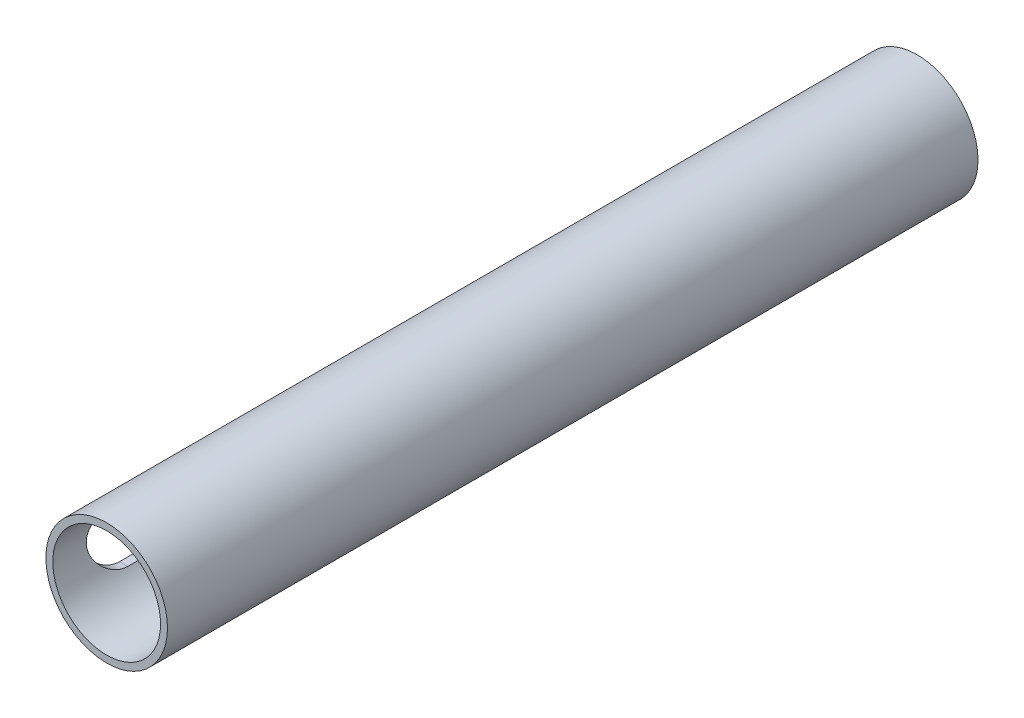
ISO-10303-21;
HEADER;
FILE_DESCRIPTION(('STEP AP214'),'2;1');
FILE_NAME('part.step','',(''),(''),'','','');
FILE_SCHEMA(('AUTOMOTIVE_DESIGN { 1 0 10303 214 1 1 1 1 }'));
ENDSEC;
DATA;
#1=APPLICATION_CONTEXT('core data for automotive mechanical design processes');
#2=APPLICATION_PROTOCOL_DEFINITION('international standard','automotive_design',2000,#1);
#3=PRODUCT_CONTEXT('',#1,'mechanical');
#4=PRODUCT('Part','Part','',(#3));
#5=PRODUCT_RELATED_PRODUCT_CATEGORY('part','',(#4));
#6=PRODUCT_DEFINITION_FORMATION('','',#4);
#7=PRODUCT_DEFINITION_CONTEXT('part definition',#1,'design');
#8=PRODUCT_DEFINITION('design','',#6,#7);
#9=PRODUCT_DEFINITION_SHAPE('','',#8);
#10=(LENGTH_UNIT() NAMED_UNIT(*) SI_UNIT(.MILLI.,.METRE.));
#11=(NAMED_UNIT(*) PLANE_ANGLE_UNIT() SI_UNIT($,.RADIAN.));
#12=(NAMED_UNIT(*) SI_UNIT($,.STERADIAN.) SOLID_ANGLE_UNIT());
#13=UNCERTAINTY_MEASURE_WITH_UNIT(LENGTH_MEASURE(1.E-05),#10,'distance_accuracy_value','');
#14=(GEOMETRIC_REPRESENTATION_CONTEXT(3) GLOBAL_UNCERTAINTY_ASSIGNED_CONTEXT((#13)) GLOBAL_UNIT_ASSIGNED_CONTEXT((#10,
#11,#12)) REPRESENTATION_CONTEXT('',''));
#15=CARTESIAN_POINT('',(0.,0.,0.));
#16=DIRECTION('',(0.,0.,1.));
#17=DIRECTION('',(1.,0.,0.));
#18=AXIS2_PLACEMENT_3D('',#15,#16,#17);
#19=CARTESIAN_POINT('',(0.,0.,152.4));
#20=DIRECTION('',(0.,0.,-1.));
#21=DIRECTION('',(-1.,0.,0.));
#22=AXIS2_PLACEMENT_3D('',#19,#20,#21);
#23=CYLINDRICAL_SURFACE('',#22,11.43);
#24=DIRECTION('',(0.,0.,-1.));
#25=VECTOR('',#24,1.);
#26=CARTESIAN_POINT('',(-9.7875102646469,-5.90335013525637,152.4));
#27=LINE('',#26,#25);
#28=CARTESIAN_POINT('',(-9.7875102646469,-5.90335013525636,10.6710401161242));
#29=VERTEX_POINT('',#28);
#30=CARTESIAN_POINT('',(-9.78751026464691,-5.90335013525637,140.211040116124));
#31=VERTEX_POINT('',#30);
#32=EDGE_CURVE('E93',#29,#31,#27,.F.);
#33=ORIENTED_EDGE('',*,*,#32,.F.);
#34=CARTESIAN_POINT('',(-9.78751026464691,-5.90335013525636,10.6710401161242));
#35=CARTESIAN_POINT('',(-9.78746142986268,-5.90338001316869,10.5172365078547));
#36=CARTESIAN_POINT('',(-9.79113407849916,-5.89734087175189,10.3634563037697));
#37=CARTESIAN_POINT('',(-9.80555795346305,-5.87335414563301,10.0572606868806));
#38=CARTESIAN_POINT('',(-9.81630448603562,-5.85541445727424,9.90484443697367));
#39=CARTESIAN_POINT('',(-9.84442701455045,-5.80800002866848,9.60340529087713));
#40=CARTESIAN_POINT('',(-9.86176237137983,-5.77859597119789,9.45436741226344));
#41=CARTESIAN_POINT('',(-9.90242607006684,-5.70863412578258,9.15976194481079));
#42=CARTESIAN_POINT('',(-9.92575516877185,-5.66807492920007,9.0141947967698));
#43=CARTESIAN_POINT('',(-9.9775602793152,-5.57637411189748,8.72781082472249));
#44=CARTESIAN_POINT('',(-10.0060227081999,-5.52526036831945,8.58698260111585));
#45=CARTESIAN_POINT('',(-10.0672642601003,-5.41287248388294,8.31039055372515));
#46=CARTESIAN_POINT('',(-10.1000450360369,-5.35159445012976,8.17462869484331));
#47=CARTESIAN_POINT('',(-10.203578304826,-5.15307324456422,7.77559090130062));
#48=CARTESIAN_POINT('',(-10.2794841982927,-5.00120637375341,7.52075863257553));
#49=CARTESIAN_POINT('',(-10.4444590966299,-4.64752620130828,7.01685038345569));
#50=CARTESIAN_POINT('',(-10.5340987028837,-4.44250237727242,6.77023548247558));
#51=CARTESIAN_POINT('',(-10.7118872235844,-3.99477691907236,6.31288057394147));
#52=CARTESIAN_POINT('',(-10.8000357069568,-3.752064589058,6.10215078614727));
#53=CARTESIAN_POINT('',(-10.9278782983526,-3.35378082084456,5.80980952685732));
#54=CARTESIAN_POINT('',(-10.9711190321461,-3.20985766207003,5.71357319044665));
#55=CARTESIAN_POINT('',(-11.0535678011128,-2.91327633395684,5.53368651971296));
#56=CARTESIAN_POINT('',(-11.0927774439185,-2.76062168490777,5.45003116178253));
#57=CARTESIAN_POINT('',(-11.1660300597481,-2.44755348117054,5.29614973523292));
#58=CARTESIAN_POINT('',(-11.2000744468504,-2.28714206594817,5.22591998974516));
#59=CARTESIAN_POINT('',(-11.2619875602964,-1.95966501597518,5.09968163590052));
#60=CARTESIAN_POINT('',(-11.2898569949077,-1.79260014697228,5.04367139645746));
#61=CARTESIAN_POINT('',(-11.3367162260517,-1.46591926004349,4.95026372942386));
#62=CARTESIAN_POINT('',(-11.3562154523436,-1.30668515252734,4.91178491510346));
#63=CARTESIAN_POINT('',(-11.3886326128908,-0.984927051105099,4.84812432948182));
#64=CARTESIAN_POINT('',(-11.4015512378412,-0.822403404329206,4.82294116266895));
#65=CARTESIAN_POINT('',(-11.4204277800199,-0.495501650253375,4.78622393500175));
#66=CARTESIAN_POINT('',(-11.4263892014603,-0.33112451868088,4.7746830027738));
#67=CARTESIAN_POINT('',(-11.4311851887741,-0.0018814809720208,4.76539408244056));
#68=CARTESIAN_POINT('',(-11.4300202297875,0.162984391845744,4.76764517477423));
#69=CARTESIAN_POINT('',(-11.4210400314541,0.476449710448079,4.78505306031898));
#70=CARTESIAN_POINT('',(-11.4138529629799,0.625136807248078,4.79899089279577));
#71=CARTESIAN_POINT('',(-11.3938208463291,0.920701285450767,4.83802394578777));
#72=CARTESIAN_POINT('',(-11.3809740226891,1.06757808408879,4.86312266749376));
#73=CARTESIAN_POINT('',(-11.3499332066283,1.3584179048913,4.92418734881478));
#74=CARTESIAN_POINT('',(-11.3317411065935,1.50238193901366,4.9601494625939));
#75=CARTESIAN_POINT('',(-11.2904213455441,1.78659449694311,5.04258311259322));
#76=CARTESIAN_POINT('',(-11.2672917920248,1.9268415728189,5.08905867898355));
#77=CARTESIAN_POINT('',(-11.2162932716946,2.20450271466833,5.19272458845031));
#78=CARTESIAN_POINT('',(-11.1883683122438,2.34185889859762,5.25004244004343));
#79=CARTESIAN_POINT('',(-11.1285982840972,2.61118077044393,5.37450219238042));
#80=CARTESIAN_POINT('',(-11.0967518029849,2.74314449323,5.4416476343843));
#81=CARTESIAN_POINT('',(-10.9963227887776,3.12994709802147,5.65706316358599));
#82=CARTESIAN_POINT('',(-10.9228189635237,3.37586344654668,5.81937501082062));
#83=CARTESIAN_POINT('',(-10.7610040241564,3.86237063148921,6.19495022653386));
#84=CARTESIAN_POINT('',(-10.671947405029,4.10002519984515,6.41166656478215));
#85=CARTESIAN_POINT('',(-10.4934559605711,4.53741078326392,6.8810117794604));
#86=CARTESIAN_POINT('',(-10.4040208462901,4.73710367530129,7.13367631643266));
#87=CARTESIAN_POINT('',(-10.2735425727106,5.01103769454863,7.5455140108941));
#88=CARTESIAN_POINT('',(-10.2292822968933,5.10052695661161,7.69374397753815));
#89=CARTESIAN_POINT('',(-10.1448088241368,5.26653680359441,7.99836631712428));
#90=CARTESIAN_POINT('',(-10.1045938541657,5.34306308025587,8.15475506807744));
#91=CARTESIAN_POINT('',(-10.0297570943986,5.48225501398412,8.47450651908818));
#92=CARTESIAN_POINT('',(-9.99512448500761,5.54494757245155,8.63785493343731));
#93=CARTESIAN_POINT('',(-9.93278348003614,5.65585972668021,8.97058269249342));
#94=CARTESIAN_POINT('',(-9.90507211870656,5.70408552322425,9.13995941840485));
#95=CARTESIAN_POINT('',(-9.85107107202934,5.79698501876996,9.53265612887494));
#96=CARTESIAN_POINT('',(-9.82744783090369,5.83671045985168,9.75756651960567));
#97=CARTESIAN_POINT('',(-9.80360212398056,5.87660577763535,10.098149557628));
#98=CARTESIAN_POINT('',(-9.79758482046371,5.88662223438729,10.2123714532389));
#99=CARTESIAN_POINT('',(-9.78953351117391,5.89999710544728,10.4413950315513));
#100=CARTESIAN_POINT('',(-9.78750129329945,5.90335253130915,10.5561969513328));
#101=CARTESIAN_POINT('',(-9.78751026464692,5.90335013525636,10.6710401161242));
#102=B_SPLINE_CURVE_WITH_KNOTS('',3,(#34,#35,#36,#37,#38,#39,#40,#41,#42,#43,#44,#45,#46,#47,
#48,#49,#50,#51,#52,#53,#54,#55,#56,#57,#58,#59,#60,#61,#62,#63,#64,#65,#66,#67,#68,#69,#70,#71,
#72,#73,#74,#75,#76,#77,#78,#79,#80,#81,#82,#83,#84,#85,#86,#87,#88,#89,#90,#91,#92,#93,#94,#95,
#96,#97,#98,#99,#100,#101),.UNSPECIFIED.,.F.,.F.,(4,2,2,2,2,2,2,2,2,2,2,2,2,2,2,2,2,2,2,2,2,2,2,
2,2,2,2,2,2,2,2,2,2,4),(0.,0.461211478964468,0.922117237000927,1.38022513922357,
1.83839091653073,2.29536169944472,2.75250790672728,3.66742133916228,4.6625049077716,
5.65787139506718,6.19264000131839,6.72719450328557,7.2616023965728,7.79594896145873,
8.29019422955562,8.7843876113329,9.2783319696627,9.7722433954062,10.2202484575698,
10.6683941589706,11.116381394304,11.5645406505272,12.018341115779,12.4723055072781,
13.3796993472797,14.3769052901268,15.3751074473261,15.9106716029591,16.4459999919977,
16.9802780095493,17.5143266951161,18.2009018825817,18.545129636118,18.8895117912553),.UNSPECIFIED.);
#103=CARTESIAN_POINT('',(-9.78751026464692,5.90335013525636,10.6710401161242));
#104=VERTEX_POINT('',#103);
#105=EDGE_CURVE('E87',#29,#104,#102,.T.);
#106=ORIENTED_EDGE('',*,*,#105,.T.);
#107=DIRECTION('',(0.,0.,-1.));
#108=VECTOR('',#107,1.);
#109=CARTESIAN_POINT('',(-9.78751026464692,5.90335013525634,152.4));
#110=LINE('',#109,#108);
#111=CARTESIAN_POINT('',(-9.78751026464692,5.90335013525634,140.211040116124));
#112=VERTEX_POINT('',#111);
#113=EDGE_CURVE('E76',#104,#112,#110,.F.);
#114=ORIENTED_EDGE('',*,*,#113,.T.);
#115=CARTESIAN_POINT('',(-9.78751026464692,5.90335013525634,140.211040116124));
#116=CARTESIAN_POINT('',(-9.78746142986268,5.90338001316868,140.364843724394));
#117=CARTESIAN_POINT('',(-9.79113407849917,5.89734087175188,140.518623928479));
#118=CARTESIAN_POINT('',(-9.80555795346305,5.873354145633,140.824819545368));
#119=CARTESIAN_POINT('',(-9.81630448603562,5.85541445727423,140.977235795275));
#120=CARTESIAN_POINT('',(-9.84442701455045,5.80800002866847,141.278674941371));
#121=CARTESIAN_POINT('',(-9.86176237137984,5.77859597119788,141.427712819985));
#122=CARTESIAN_POINT('',(-9.90242607006684,5.70863412578257,141.722318287438));
#123=CARTESIAN_POINT('',(-9.92575516877185,5.66807492920006,141.867885435479));
#124=CARTESIAN_POINT('',(-9.97756027931521,5.57637411189747,142.154269407526));
#125=CARTESIAN_POINT('',(-10.0060227081999,5.52526036831945,142.295097631133));
#126=CARTESIAN_POINT('',(-10.0672642601003,5.41287248388293,142.571689678523));
#127=CARTESIAN_POINT('',(-10.1000450360369,5.35159445012975,142.707451537405));
#128=CARTESIAN_POINT('',(-10.203578304826,5.15307324456421,143.106489330948));
#129=CARTESIAN_POINT('',(-10.2794841982927,5.0012063737534,143.361321599673));
#130=CARTESIAN_POINT('',(-10.4444590966299,4.64752620130826,143.865229848793));
#131=CARTESIAN_POINT('',(-10.5340987028837,4.4425023772724,144.111844749773));
#132=CARTESIAN_POINT('',(-10.7118872235844,3.99477691907233,144.569199658307));
#133=CARTESIAN_POINT('',(-10.8000357069568,3.75206458905797,144.779929446101));
#134=CARTESIAN_POINT('',(-10.9278782983526,3.35378082084452,145.072270705391));
#135=CARTESIAN_POINT('',(-10.9711190321461,3.20985766206999,145.168507041802));
#136=CARTESIAN_POINT('',(-11.0535678011128,2.91327633395681,145.348393712536));
#137=CARTESIAN_POINT('',(-11.0927774439185,2.76062168490773,145.432049070466));
#138=CARTESIAN_POINT('',(-11.1660300597481,2.44755348117051,145.585930497016));
#139=CARTESIAN_POINT('',(-11.2000744468504,2.28714206594814,145.656160242503));
#140=CARTESIAN_POINT('',(-11.2619875602964,1.95966501597515,145.782398596348));
#141=CARTESIAN_POINT('',(-11.2898569949077,1.79260014697226,145.838408835791));
#142=CARTESIAN_POINT('',(-11.3367162260517,1.46591926004346,145.931816502825));
#143=CARTESIAN_POINT('',(-11.3562154523436,1.30668515252731,145.970295317145));
#144=CARTESIAN_POINT('',(-11.3886326128908,0.984927051105073,146.033955902767));
#145=CARTESIAN_POINT('',(-11.4015512378412,0.822403404329181,146.05913906958));
#146=CARTESIAN_POINT('',(-11.4204277800199,0.49550165025335,146.095856297247));
#147=CARTESIAN_POINT('',(-11.4263892014603,0.331124518680855,146.107397229475));
#148=CARTESIAN_POINT('',(-11.4311851887741,0.00188148097199519,146.116686149808));
#149=CARTESIAN_POINT('',(-11.4300202297875,-0.162984391845771,146.114435057474));
#150=CARTESIAN_POINT('',(-11.4210400314541,-0.476449710448109,146.097027171929));
#151=CARTESIAN_POINT('',(-11.4138529629799,-0.625136807248109,146.083089339453));
#152=CARTESIAN_POINT('',(-11.3938208463291,-0.920701285450799,146.044056286461));
#153=CARTESIAN_POINT('',(-11.3809740226891,-1.06757808408883,146.018957564755));
#154=CARTESIAN_POINT('',(-11.3499332066283,-1.35841790489133,145.957892883434));
#155=CARTESIAN_POINT('',(-11.3317411065935,-1.50238193901369,145.921930769655));
#156=CARTESIAN_POINT('',(-11.2904213455441,-1.78659449694313,145.839497119655));
#157=CARTESIAN_POINT('',(-11.2672917920248,-1.92684157281893,145.793021553265));
#158=CARTESIAN_POINT('',(-11.2162932716946,-2.20450271466835,145.689355643798));
#159=CARTESIAN_POINT('',(-11.1883683122438,-2.34185889859765,145.632037792205));
#160=CARTESIAN_POINT('',(-11.1285982840972,-2.61118077044396,145.507578039868));
#161=CARTESIAN_POINT('',(-11.0967518029849,-2.74314449323003,145.440432597864));
#162=CARTESIAN_POINT('',(-10.9963227887776,-3.1299470980215,145.225017068662));
#163=CARTESIAN_POINT('',(-10.9228189635237,-3.3758634465467,145.062705221428));
#164=CARTESIAN_POINT('',(-10.7610040241564,-3.86237063148922,144.687130005715));
#165=CARTESIAN_POINT('',(-10.671947405029,-4.10002519984516,144.470413667466));
#166=CARTESIAN_POINT('',(-10.4934559605711,-4.53741078326394,144.001068452788));
#167=CARTESIAN_POINT('',(-10.40402084629,-4.73710367530131,143.748403915816));
#168=CARTESIAN_POINT('',(-10.2735425727106,-5.01103769454865,143.336566221354));
#169=CARTESIAN_POINT('',(-10.2292822968933,-5.10052695661163,143.18833625471));
#170=CARTESIAN_POINT('',(-10.1448088241368,-5.26653680359443,142.883713915124));
#171=CARTESIAN_POINT('',(-10.1045938541657,-5.34306308025588,142.727325164171));
#172=CARTESIAN_POINT('',(-10.0297570943986,-5.48225501398413,142.40757371316));
#173=CARTESIAN_POINT('',(-9.9951244850076,-5.54494757245156,142.244225298811));
#174=CARTESIAN_POINT('',(-9.93278348003613,-5.65585972668023,141.911497539755));
#175=CARTESIAN_POINT('',(-9.90507211870655,-5.70408552322427,141.742120813844));
#176=CARTESIAN_POINT('',(-9.85107107202933,-5.79698501876998,141.349424103374));
#177=CARTESIAN_POINT('',(-9.82744783090368,-5.8367104598517,141.124513712643));
#178=CARTESIAN_POINT('',(-9.80360212398056,-5.87660577763536,140.78393067462));
#179=CARTESIAN_POINT('',(-9.7975848204637,-5.88662223438731,140.66970877901));
#180=CARTESIAN_POINT('',(-9.7895335111739,-5.8999971054473,140.440685200697));
#181=CARTESIAN_POINT('',(-9.78750129329945,-5.90335253130917,140.325883280916));
#182=CARTESIAN_POINT('',(-9.78751026464691,-5.90335013525637,140.211040116124));
#183=B_SPLINE_CURVE_WITH_KNOTS('',3,(#115,#116,#117,#118,#119,#120,#121,#122,#123,#124,#125,
#126,#127,#128,#129,#130,#131,#132,#133,#134,#135,#136,#137,#138,#139,#140,#141,#142,#143,#144,
#145,#146,#147,#148,#149,#150,#151,#152,#153,#154,#155,#156,#157,#158,#159,#160,#161,#162,#163,
#164,#165,#166,#167,#168,#169,#170,#171,#172,#173,#174,#175,#176,#177,#178,#179,#180,#181,#182),
.UNSPECIFIED.,.F.,.F.,(4,2,2,2,2,2,2,2,2,2,2,2,2,2,2,2,2,2,2,2,2,2,2,2,2,2,2,2,2,2,2,2,2,4),(0.,
0.461211478964465,0.922117237000922,1.38022513922353,1.83839091653074,2.29536169944472,
2.75250790672729,3.66742133916228,4.66250490777162,5.65787139506721,6.19264000131841,
6.7271945032856,7.26160239657282,7.79594896145875,8.29019422955564,8.78438761133292,
9.27833196966271,9.77224339540622,10.2202484575698,10.6683941589706,11.1163813943041,
11.5645406505272,12.018341115779,12.4723055072781,13.3796993472797,14.3769052901268,
15.3751074473261,15.9106716029591,16.4459999919977,16.9802780095494,17.5143266951162,
18.2009018825817,18.545129636118,18.8895117912553),.UNSPECIFIED.);
#184=EDGE_CURVE('E81',#112,#31,#183,.T.);
#185=ORIENTED_EDGE('',*,*,#184,.T.);
#186=EDGE_LOOP('',(#33,#106,#114,#185));
#187=FACE_BOUND('',#186,.T.);
#188=CARTESIAN_POINT('',(0.,0.,152.4));
#189=DIRECTION('',(0.,0.,1.));
#190=DIRECTION('',(1.,0.,0.));
#191=AXIS2_PLACEMENT_3D('',#188,#189,#190);
#192=CIRCLE('',#191,11.43);
#193=CARTESIAN_POINT('',(11.43,0.,152.4));
#194=VERTEX_POINT('',#193);
#195=EDGE_CURVE('E149',#194,#194,#192,.T.);
#196=ORIENTED_EDGE('',*,*,#195,.F.);
#197=EDGE_LOOP('',(#196));
#198=FACE_BOUND('',#197,.T.);
#199=CARTESIAN_POINT('',(0.,0.,0.));
#200=DIRECTION('',(0.,0.,1.));
#201=DIRECTION('',(1.,0.,0.));
#202=AXIS2_PLACEMENT_3D('',#199,#200,#201);
#203=CIRCLE('',#202,11.43);
#204=CARTESIAN_POINT('',(11.43,0.,0.));
#205=VERTEX_POINT('',#204);
#206=EDGE_CURVE('E151',#205,#205,#203,.T.);
#207=ORIENTED_EDGE('',*,*,#206,.T.);
#208=EDGE_LOOP('',(#207));
#209=FACE_BOUND('',#208,.T.);
#210=ADVANCED_FACE('F33',(#187,#198,#209),#23,.T.);
#211=CARTESIAN_POINT('',(0.,0.,152.4));
#212=DIRECTION('',(0.,0.,1.));
#213=DIRECTION('',(1.,0.,0.));
#214=AXIS2_PLACEMENT_3D('',#211,#212,#213);
#215=PLANE('',#214);
#216=CARTESIAN_POINT('',(0.,0.,152.4));
#217=DIRECTION('',(0.,0.,1.));
#218=DIRECTION('',(1.,0.,0.));
#219=AXIS2_PLACEMENT_3D('',#216,#217,#218);
#220=CIRCLE('',#219,10.1332036012473);
#221=CARTESIAN_POINT('',(10.1332036012473,0.,152.4));
#222=VERTEX_POINT('',#221);
#223=EDGE_CURVE('E94',#222,#222,#220,.T.);
#224=ORIENTED_EDGE('',*,*,#223,.F.);
#225=EDGE_LOOP('',(#224));
#226=FACE_BOUND('',#225,.T.);
#227=ORIENTED_EDGE('',*,*,#195,.T.);
#228=EDGE_LOOP('',(#227));
#229=FACE_BOUND('',#228,.T.);
#230=ADVANCED_FACE('F121',(#226,#229),#215,.T.);
#231=CARTESIAN_POINT('',(0.,0.,0.));
#232=DIRECTION('',(0.,0.,1.));
#233=DIRECTION('',(1.,0.,0.));
#234=AXIS2_PLACEMENT_3D('',#231,#232,#233);
#235=PLANE('',#234);
#236=ORIENTED_EDGE('',*,*,#206,.F.);
#237=EDGE_LOOP('',(#236));
#238=FACE_BOUND('',#237,.T.);
#239=ADVANCED_FACE('F119',(#238),#235,.F.);
#240=CARTESIAN_POINT('',(0.,0.,2.54000000000001));
#241=DIRECTION('',(0.,0.,1.));
#242=DIRECTION('',(1.,0.,0.));
#243=AXIS2_PLACEMENT_3D('',#240,#241,#242);
#244=CYLINDRICAL_SURFACE('',#243,10.1332036012473);
#245=DIRECTION('',(0.,0.,1.));
#246=VECTOR('',#245,1.);
#247=CARTESIAN_POINT('',(-8.23603499293808,5.90335013525636,2.54000000000002));
#248=LINE('',#247,#246);
#249=CARTESIAN_POINT('',(-8.23603499293808,5.90335013525634,140.211040116124));
#250=VERTEX_POINT('',#249);
#251=CARTESIAN_POINT('',(-8.23603499293808,5.90335013525636,10.6710401161242));
#252=VERTEX_POINT('',#251);
#253=EDGE_CURVE('E130',#250,#252,#248,.F.);
#254=ORIENTED_EDGE('',*,*,#253,.T.);
#255=CARTESIAN_POINT('',(-8.23603499293808,5.90335013525636,10.6710401161242));
#256=CARTESIAN_POINT('',(-8.23597452114483,5.90338347206681,10.5207366165256));
#257=CARTESIAN_POINT('',(-8.24014756482242,5.89761154965383,10.3704645490996));
#258=CARTESIAN_POINT('',(-8.25650522721466,5.87471648136284,10.0713578206434));
#259=CARTESIAN_POINT('',(-8.26868264290458,5.85760354099783,9.92252198923565));
#260=CARTESIAN_POINT('',(-8.30047435905033,5.81245635266702,9.62850432917112));
#261=CARTESIAN_POINT('',(-8.32003168682636,5.78450572684781,9.48330337284716));
#262=CARTESIAN_POINT('',(-8.36581290084544,5.71809621184178,9.19638697084084));
#263=CARTESIAN_POINT('',(-8.39203800409089,5.67963540424056,9.05467216663527));
#264=CARTESIAN_POINT('',(-8.45012620571694,5.59284283805386,8.77608270112388));
#265=CARTESIAN_POINT('',(-8.48196852134909,5.54454736776456,8.63919235625825));
#266=CARTESIAN_POINT('',(-8.55035997369661,5.43848713718027,8.37032231378946));
#267=CARTESIAN_POINT('',(-8.58691087297015,5.38071882870854,8.23834447904687));
#268=CARTESIAN_POINT('',(-8.70221299099161,5.19372336689728,7.85016297550651));
#269=CARTESIAN_POINT('',(-8.78654005051027,5.05091066238219,7.60204383000969));
#270=CARTESIAN_POINT('',(-8.97207137773502,4.71430233309905,7.10378440451219));
#271=CARTESIAN_POINT('',(-9.0741044066032,4.51655600096771,6.85662248072386));
#272=CARTESIAN_POINT('',(-9.2261058185707,4.19226969998682,6.51179150506863));
#273=CARTESIAN_POINT('',(-9.27662334429684,4.07949961231459,6.40111749438154));
#274=CARTESIAN_POINT('',(-9.37622663570216,3.84504759963407,6.18883598143333));
#275=CARTESIAN_POINT('',(-9.42531215709376,3.72336416637299,6.08723002008567));
#276=CARTESIAN_POINT('',(-9.52573524253817,3.45892283707699,5.88398156474813));
#277=CARTESIAN_POINT('',(-9.57680388337837,3.31527575887289,5.78336024564658));
#278=CARTESIAN_POINT('',(-9.67442779880496,3.01854928029206,5.59474328739886));
#279=CARTESIAN_POINT('',(-9.72098506222941,2.86547408542434,5.50674207639742));
#280=CARTESIAN_POINT('',(-9.80826381409017,2.550769932782,5.34427185982204));
#281=CARTESIAN_POINT('',(-9.84898734963319,2.38914400293214,5.26979810487364));
#282=CARTESIAN_POINT('',(-9.92337759376773,2.05842223574905,5.13531153061208));
#283=CARTESIAN_POINT('',(-9.95704538190658,1.88932754595562,5.07529649886692));
#284=CARTESIAN_POINT('',(-10.0135432771066,1.560759619146,4.97540038608973));
#285=CARTESIAN_POINT('',(-10.0370814681027,1.40181406406411,4.93418281328904));
#286=CARTESIAN_POINT('',(-10.0767724410715,1.0801492352017,4.86501955164589));
#287=CARTESIAN_POINT('',(-10.0929256326196,0.917430171227772,4.8370731267761));
#288=CARTESIAN_POINT('',(-10.1173602011392,0.58975510715926,4.79490190363761));
#289=CARTESIAN_POINT('',(-10.1256472590492,0.424800808816486,4.78066720262248));
#290=CARTESIAN_POINT('',(-10.1341164646461,0.0940775575698871,4.76612004810192));
#291=CARTESIAN_POINT('',(-10.134299368442,-0.0716913178914881,4.76580629578675));
#292=CARTESIAN_POINT('',(-10.1270151267862,-0.383027523160514,4.77831744961925));
#293=CARTESIAN_POINT('',(-10.120443947847,-0.528680846779018,4.78960356333751));
#294=CARTESIAN_POINT('',(-10.1011445077423,-0.818397929681784,4.82287522435109));
#295=CARTESIAN_POINT('',(-10.0884142263192,-0.962461151524142,4.84486428235161));
#296=CARTESIAN_POINT('',(-10.057095891373,-1.24789696426085,4.89926404960944));
#297=CARTESIAN_POINT('',(-10.0385099404802,-1.38927050166445,4.93167101813042));
#298=CARTESIAN_POINT('',(-9.99588758168999,-1.66853538290032,5.00655046122468));
#299=CARTESIAN_POINT('',(-9.97184907365696,-1.80642536218356,5.04902681446053));
#300=CARTESIAN_POINT('',(-9.91864275598841,-2.07887985227838,5.14394691954645));
#301=CARTESIAN_POINT('',(-9.88943872563661,-2.21341267438139,5.19646128296101));
#302=CARTESIAN_POINT('',(-9.82662594439847,-2.47743531366232,5.31076239982334));
#303=CARTESIAN_POINT('',(-9.79301562242465,-2.60692331061669,5.3725524617177));
#304=CARTESIAN_POINT('',(-9.68656031264642,-2.98686803768699,5.57106780257483));
#305=CARTESIAN_POINT('',(-9.60805374354343,-3.22898919740817,5.72100295642294));
#306=CARTESIAN_POINT('',(-9.43214689708923,-3.71354937220934,6.07118544076355));
#307=CARTESIAN_POINT('',(-9.33361168002529,-3.95279413892293,6.27524393814096));
#308=CARTESIAN_POINT('',(-9.13333010668784,-4.39581783434301,6.71825261862482));
#309=CARTESIAN_POINT('',(-9.03157920751482,-4.5995436721814,6.95725406780517));
#310=CARTESIAN_POINT('',(-8.87856662800069,-4.88531274797434,7.35238310983701));
#311=CARTESIAN_POINT('',(-8.8250364051174,-4.98108753212226,7.49789963060962));
#312=CARTESIAN_POINT('',(-8.72166233022273,-5.15994912018764,7.79789687644855));
#313=CARTESIAN_POINT('',(-8.67181943993086,-5.24303261997527,7.95237992152015));
#314=CARTESIAN_POINT('',(-8.57781529567027,-5.39545234663163,8.26907446062654));
#315=CARTESIAN_POINT('',(-8.53363849713785,-5.46482648025599,8.4312630613009));
#316=CARTESIAN_POINT('',(-8.45269735027654,-5.58920696355646,8.76274340578866));
#317=CARTESIAN_POINT('',(-8.41592697264815,-5.64422501087257,8.93202923524908));
#318=CARTESIAN_POINT('',(-8.36023889459869,-5.72625258941755,9.22999987527274));
#319=CARTESIAN_POINT('',(-8.33918105397709,-5.75681400879461,9.35731818906179));
#320=CARTESIAN_POINT('',(-8.30255883548787,-5.80950581965294,9.61444204213568));
#321=CARTESIAN_POINT('',(-8.28699276356439,-5.83163881123414,9.74424680137314));
#322=CARTESIAN_POINT('',(-8.2617795130911,-5.86730974750224,10.0063642207464));
#323=CARTESIAN_POINT('',(-8.252166397055,-5.88079824388296,10.1386869279326));
#324=CARTESIAN_POINT('',(-8.23927274966145,-5.89883229419622,10.4043465119217));
#325=CARTESIAN_POINT('',(-8.2359970856357,-5.90337097448334,10.5376840893346));
#326=CARTESIAN_POINT('',(-8.23603499293808,-5.90335013525636,10.6710401161242));
#327=B_SPLINE_CURVE_WITH_KNOTS('',3,(#255,#256,#257,#258,#259,#260,#261,#262,#263,#264,#265,
#266,#267,#268,#269,#270,#271,#272,#273,#274,#275,#276,#277,#278,#279,#280,#281,#282,#283,#284,
#285,#286,#287,#288,#289,#290,#291,#292,#293,#294,#295,#296,#297,#298,#299,#300,#301,#302,#303,
#304,#305,#306,#307,#308,#309,#310,#311,#312,#313,#314,#315,#316,#317,#318,#319,#320,#321,#322,
#323,#324,#325,#326),.UNSPECIFIED.,.F.,.F.,(4,2,2,2,2,2,2,2,2,2,2,2,2,2,2,2,2,2,2,2,2,2,2,2,2,2,
2,2,2,2,2,2,2,2,2,4),(0.,0.45069201357325,0.900979009801647,1.34785865477716,1.7948199228536,
2.24016092551526,2.68566911916581,3.57774333391655,4.57125543507693,5.06851059819366,
5.56585009852707,6.11313807252872,6.66018366667662,7.20703682497033,7.75380625215225,
8.2507432125852,8.74765260932034,9.24420286336792,9.74070678970604,10.1788968980351,
10.6172308353894,11.0554075566052,11.4937533357323,11.9353043441587,12.377013220402,
13.2598423039271,14.2446540813705,15.2309254869971,15.7770807944603,16.3233780500187,
16.8681429681764,17.4124626044629,17.8099463572503,18.2073073900766,18.6069215874836,
19.0068425775756),.UNSPECIFIED.);
#328=CARTESIAN_POINT('',(-8.23603499293808,-5.90335013525636,10.6710401161242));
#329=VERTEX_POINT('',#328);
#330=EDGE_CURVE('E11',#252,#329,#327,.T.);
#331=ORIENTED_EDGE('',*,*,#330,.T.);
#332=DIRECTION('',(0.,0.,1.));
#333=VECTOR('',#332,1.);
#334=CARTESIAN_POINT('',(-8.23603499293808,-5.90335013525636,2.54000000000001));
#335=LINE('',#334,#333);
#336=CARTESIAN_POINT('',(-8.23603499293807,-5.90335013525637,140.211040116124));
#337=VERTEX_POINT('',#336);
#338=EDGE_CURVE('E46',#337,#329,#335,.F.);
#339=ORIENTED_EDGE('',*,*,#338,.F.);
#340=CARTESIAN_POINT('',(-8.23603499293807,-5.90335013525637,140.211040116124));
#341=CARTESIAN_POINT('',(-8.23597452114482,-5.90338347206683,140.361343615723));
#342=CARTESIAN_POINT('',(-8.24014756482241,-5.89761154965384,140.511615683149));
#343=CARTESIAN_POINT('',(-8.25650522721465,-5.87471648136285,140.810722411605));
#344=CARTESIAN_POINT('',(-8.26868264290457,-5.85760354099785,140.959558243013));
#345=CARTESIAN_POINT('',(-8.30047435905032,-5.81245635266704,141.253575903077));
#346=CARTESIAN_POINT('',(-8.32003168682635,-5.78450572684783,141.398776859401));
#347=CARTESIAN_POINT('',(-8.36581290084543,-5.71809621184179,141.685693261408));
#348=CARTESIAN_POINT('',(-8.39203800409088,-5.67963540424058,141.827408065613));
#349=CARTESIAN_POINT('',(-8.45012620571694,-5.59284283805387,142.105997531125));
#350=CARTESIAN_POINT('',(-8.48196852134908,-5.54454736776457,142.24288787599));
#351=CARTESIAN_POINT('',(-8.55035997369661,-5.43848713718028,142.511757918459));
#352=CARTESIAN_POINT('',(-8.58691087297014,-5.38071882870855,142.643735753202));
#353=CARTESIAN_POINT('',(-8.7022129909916,-5.19372336689729,143.031917256742));
#354=CARTESIAN_POINT('',(-8.78654005051026,-5.05091066238221,143.280036402239));
#355=CARTESIAN_POINT('',(-8.97207137773501,-4.71430233309906,143.778295827736));
#356=CARTESIAN_POINT('',(-9.0741044066032,-4.51655600096772,144.025457751525));
#357=CARTESIAN_POINT('',(-9.22610581857069,-4.19226969998683,144.37028872718));
#358=CARTESIAN_POINT('',(-9.27662334429683,-4.0794996123146,144.480962737867));
#359=CARTESIAN_POINT('',(-9.37622663570215,-3.84504759963408,144.693244250815));
#360=CARTESIAN_POINT('',(-9.42531215709375,-3.723364166373,144.794850212163));
#361=CARTESIAN_POINT('',(-9.52573524253816,-3.458922837077,144.9980986675));
#362=CARTESIAN_POINT('',(-9.57680388337836,-3.3152757588729,145.098719986602));
#363=CARTESIAN_POINT('',(-9.67442779880496,-3.01854928029207,145.28733694485));
#364=CARTESIAN_POINT('',(-9.72098506222941,-2.86547408542435,145.375338155851));
#365=CARTESIAN_POINT('',(-9.80826381409017,-2.550769932782,145.537808372426));
#366=CARTESIAN_POINT('',(-9.84898734963319,-2.38914400293214,145.612282127375));
#367=CARTESIAN_POINT('',(-9.92337759376773,-2.05842223574904,145.746768701636));
#368=CARTESIAN_POINT('',(-9.95704538190658,-1.88932754595561,145.806783733382));
#369=CARTESIAN_POINT('',(-10.0135432771066,-1.56075961914599,145.906679846159));
#370=CARTESIAN_POINT('',(-10.0370814681027,-1.4018140640641,145.947897418959));
#371=CARTESIAN_POINT('',(-10.0767724410715,-1.08014923520169,146.017060680603));
#372=CARTESIAN_POINT('',(-10.0929256326196,-0.917430171227769,146.045007105472));
#373=CARTESIAN_POINT('',(-10.1173602011392,-0.589755107159261,146.087178328611));
#374=CARTESIAN_POINT('',(-10.1256472590492,-0.424800808816488,146.101413029626));
#375=CARTESIAN_POINT('',(-10.1341164646461,-0.0940775575698911,146.115960184147));
#376=CARTESIAN_POINT('',(-10.134299368442,0.0716913178914833,146.116273936462));
#377=CARTESIAN_POINT('',(-10.1270151267862,0.383027523160509,146.103762782629));
#378=CARTESIAN_POINT('',(-10.120443947847,0.528680846779014,146.092476668911));
#379=CARTESIAN_POINT('',(-10.1011445077423,0.818397929681781,146.059205007897));
#380=CARTESIAN_POINT('',(-10.0884142263192,0.962461151524138,146.037215949897));
#381=CARTESIAN_POINT('',(-10.057095891373,1.24789696426085,145.982816182639));
#382=CARTESIAN_POINT('',(-10.0385099404802,1.38927050166444,145.950409214118));
#383=CARTESIAN_POINT('',(-9.99588758169,1.66853538290031,145.875529771024));
#384=CARTESIAN_POINT('',(-9.97184907365696,1.80642536218355,145.833053417788));
#385=CARTESIAN_POINT('',(-9.91864275598841,2.07887985227838,145.738133312702));
#386=CARTESIAN_POINT('',(-9.88943872563661,2.21341267438138,145.685618949287));
#387=CARTESIAN_POINT('',(-9.82662594439848,2.47743531366231,145.571317832425));
#388=CARTESIAN_POINT('',(-9.79301562242466,2.60692331061668,145.509527770531));
#389=CARTESIAN_POINT('',(-9.68656031264643,2.98686803768698,145.311012429674));
#390=CARTESIAN_POINT('',(-9.60805374354343,3.22898919740816,145.161077275826));
#391=CARTESIAN_POINT('',(-9.43214689708923,3.71354937220933,144.810894791485));
#392=CARTESIAN_POINT('',(-9.3336116800253,3.95279413892291,144.606836294108));
#393=CARTESIAN_POINT('',(-9.13333010668785,4.395817834343,144.163827613624));
#394=CARTESIAN_POINT('',(-9.03157920751482,4.59954367218139,143.924826164443));
#395=CARTESIAN_POINT('',(-8.8785666280007,4.88531274797434,143.529697122411));
#396=CARTESIAN_POINT('',(-8.82503640511741,4.98108753212226,143.384180601639));
#397=CARTESIAN_POINT('',(-8.72166233022274,5.15994912018763,143.0841833558));
#398=CARTESIAN_POINT('',(-8.67181943993087,5.24303261997526,142.929700310728));
#399=CARTESIAN_POINT('',(-8.57781529567029,5.39545234663161,142.613005771622));
#400=CARTESIAN_POINT('',(-8.53363849713787,5.46482648025597,142.450817170948));
#401=CARTESIAN_POINT('',(-8.45269735027655,5.58920696355644,142.11933682646));
#402=CARTESIAN_POINT('',(-8.41592697264816,5.64422501087255,141.950050996999));
#403=CARTESIAN_POINT('',(-8.3602388945987,5.72625258941753,141.652080356976));
#404=CARTESIAN_POINT('',(-8.33918105397711,5.75681400879459,141.524762043187));
#405=CARTESIAN_POINT('',(-8.30255883548788,5.80950581965292,141.267638190113));
#406=CARTESIAN_POINT('',(-8.2869927635644,5.83163881123412,141.137833430875));
#407=CARTESIAN_POINT('',(-8.2617795130911,5.86730974750222,140.875716011502));
#408=CARTESIAN_POINT('',(-8.25216639705501,5.88079824388295,140.743393304316));
#409=CARTESIAN_POINT('',(-8.23927274966146,5.8988322941962,140.477733720327));
#410=CARTESIAN_POINT('',(-8.23599708563571,5.90337097448333,140.344396142914));
#411=CARTESIAN_POINT('',(-8.23603499293809,5.90335013525634,140.211040116124));
#412=B_SPLINE_CURVE_WITH_KNOTS('',3,(#340,#341,#342,#343,#344,#345,#346,#347,#348,#349,#350,
#351,#352,#353,#354,#355,#356,#357,#358,#359,#360,#361,#362,#363,#364,#365,#366,#367,#368,#369,
#370,#371,#372,#373,#374,#375,#376,#377,#378,#379,#380,#381,#382,#383,#384,#385,#386,#387,#388,
#389,#390,#391,#392,#393,#394,#395,#396,#397,#398,#399,#400,#401,#402,#403,#404,#405,#406,#407,
#408,#409,#410,#411),.UNSPECIFIED.,.F.,.F.,(4,2,2,2,2,2,2,2,2,2,2,2,2,2,2,2,2,2,2,2,2,2,2,2,2,2,
2,2,2,2,2,2,2,2,2,4),(0.,0.450692013573271,0.900979009801645,1.34785865477717,1.7948199228536,
2.24016092551529,2.68566911916582,3.57774333391655,4.57125543507694,5.06851059819367,
5.56585009852706,6.11313807252874,6.66018366667663,7.20703682497035,7.75380625215228,
8.25074321258523,8.74765260932036,9.24420286336794,9.74070678970605,10.1788968980351,
10.6172308353894,11.0554075566052,11.4937533357323,11.9353043441587,12.377013220402,
13.2598423039271,14.2446540813705,15.2309254869971,15.7770807944603,16.3233780500187,
16.8681429681764,17.4124626044629,17.8099463572502,18.2073073900765,18.6069215874836,
19.0068425775756),.UNSPECIFIED.);
#413=EDGE_CURVE('E124',#337,#250,#412,.T.);
#414=ORIENTED_EDGE('',*,*,#413,.T.);
#415=EDGE_LOOP('',(#254,#331,#339,#414));
#416=FACE_BOUND('',#415,.T.);
#417=CARTESIAN_POINT('',(0.,0.,2.54000000000001));
#418=DIRECTION('',(0.,0.,1.));
#419=DIRECTION('',(1.,0.,0.));
#420=AXIS2_PLACEMENT_3D('',#417,#418,#419);
#421=CIRCLE('',#420,10.1332036012473);
#422=CARTESIAN_POINT('',(10.1332036012473,0.,2.54000000000001));
#423=VERTEX_POINT('',#422);
#424=EDGE_CURVE('E97',#423,#423,#421,.T.);
#425=ORIENTED_EDGE('',*,*,#424,.F.);
#426=EDGE_LOOP('',(#425));
#427=FACE_BOUND('',#426,.T.);
#428=ORIENTED_EDGE('',*,*,#223,.T.);
#429=EDGE_LOOP('',(#428));
#430=FACE_BOUND('',#429,.T.);
#431=ADVANCED_FACE('F114',(#416,#427,#430),#244,.F.);
#432=CARTESIAN_POINT('',(0.,0.,2.54000000000001));
#433=DIRECTION('',(0.,0.,1.));
#434=DIRECTION('',(1.,0.,0.));
#435=AXIS2_PLACEMENT_3D('',#432,#433,#434);
#436=PLANE('',#435);
#437=ORIENTED_EDGE('',*,*,#424,.T.);
#438=EDGE_LOOP('',(#437));
#439=FACE_BOUND('',#438,.T.);
#440=ADVANCED_FACE('F110',(#439),#436,.T.);
#441=CARTESIAN_POINT('',(-12.7,0.,10.6710401161242));
#442=DIRECTION('',(1.,0.,0.));
#443=DIRECTION('',(0.,0.,-1.));
#444=AXIS2_PLACEMENT_3D('',#441,#442,#443);
#445=CYLINDRICAL_SURFACE('',#444,5.90335013525636);
#446=DIRECTION('',(1.,0.,0.));
#447=VECTOR('',#446,1.);
#448=CARTESIAN_POINT('',(-12.7,-5.90335013525636,10.6710401161242));
#449=LINE('',#448,#447);
#450=EDGE_CURVE('E82',#29,#329,#449,.T.);
#451=ORIENTED_EDGE('',*,*,#450,.T.);
#452=ORIENTED_EDGE('',*,*,#330,.F.);
#453=DIRECTION('',(1.,0.,0.));
#454=VECTOR('',#453,1.);
#455=CARTESIAN_POINT('',(-12.7,5.90335013525636,10.6710401161242));
#456=LINE('',#455,#454);
#457=EDGE_CURVE('E58',#104,#252,#456,.T.);
#458=ORIENTED_EDGE('',*,*,#457,.F.);
#459=ORIENTED_EDGE('',*,*,#105,.F.);
#460=EDGE_LOOP('',(#451,#452,#458,#459));
#461=FACE_BOUND('',#460,.T.);
#462=ADVANCED_FACE('F86',(#461),#445,.F.);
#463=CARTESIAN_POINT('',(-12.7,-5.90335013525636,10.6710401161242));
#464=DIRECTION('',(0.,1.,0.));
#465=DIRECTION('',(0.,0.,1.));
#466=AXIS2_PLACEMENT_3D('',#463,#464,#465);
#467=PLANE('',#466);
#468=ORIENTED_EDGE('',*,*,#32,.T.);
#469=DIRECTION('',(1.,0.,0.));
#470=VECTOR('',#469,1.);
#471=CARTESIAN_POINT('',(-12.7,-5.90335013525637,140.211040116124));
#472=LINE('',#471,#470);
#473=EDGE_CURVE('E143',#31,#337,#472,.T.);
#474=ORIENTED_EDGE('',*,*,#473,.T.);
#475=ORIENTED_EDGE('',*,*,#338,.T.);
#476=ORIENTED_EDGE('',*,*,#450,.F.);
#477=EDGE_LOOP('',(#468,#474,#475,#476));
#478=FACE_BOUND('',#477,.T.);
#479=ADVANCED_FACE('F109',(#478),#467,.T.);
#480=CARTESIAN_POINT('',(-12.7,0.,140.211040116124));
#481=DIRECTION('',(1.,0.,0.));
#482=DIRECTION('',(0.,0.,-1.));
#483=AXIS2_PLACEMENT_3D('',#480,#481,#482);
#484=CYLINDRICAL_SURFACE('',#483,5.90335013525636);
#485=DIRECTION('',(1.,0.,0.));
#486=VECTOR('',#485,1.);
#487=CARTESIAN_POINT('',(-12.7,5.90335013525634,140.211040116124));
#488=LINE('',#487,#486);
#489=EDGE_CURVE('E53',#112,#250,#488,.T.);
#490=ORIENTED_EDGE('',*,*,#489,.T.);
#491=ORIENTED_EDGE('',*,*,#413,.F.);
#492=ORIENTED_EDGE('',*,*,#473,.F.);
#493=ORIENTED_EDGE('',*,*,#184,.F.);
#494=EDGE_LOOP('',(#490,#491,#492,#493));
#495=FACE_BOUND('',#494,.T.);
#496=ADVANCED_FACE('F132',(#495),#484,.F.);
#497=CARTESIAN_POINT('',(-12.7,5.90335013525636,10.6710401161242));
#498=DIRECTION('',(0.,1.,0.));
#499=DIRECTION('',(0.,0.,1.));
#500=AXIS2_PLACEMENT_3D('',#497,#498,#499);
#501=PLANE('',#500);
#502=ORIENTED_EDGE('',*,*,#457,.T.);
#503=ORIENTED_EDGE('',*,*,#253,.F.);
#504=ORIENTED_EDGE('',*,*,#489,.F.);
#505=ORIENTED_EDGE('',*,*,#113,.F.);
#506=EDGE_LOOP('',(#502,#503,#504,#505));
#507=FACE_BOUND('',#506,.T.);
#508=ADVANCED_FACE('F77',(#507),#501,.F.);
#509=CLOSED_SHELL('',(#210,#230,#239,#431,#440,#462,#479,#496,#508));
#510=MANIFOLD_SOLID_BREP('B2',#509);
#511=ADVANCED_BREP_SHAPE_REPRESENTATION('',(#18,#510),#14);
#512=SHAPE_DEFINITION_REPRESENTATION(#9,#511);
ENDSEC;
END-ISO-10303-21;
